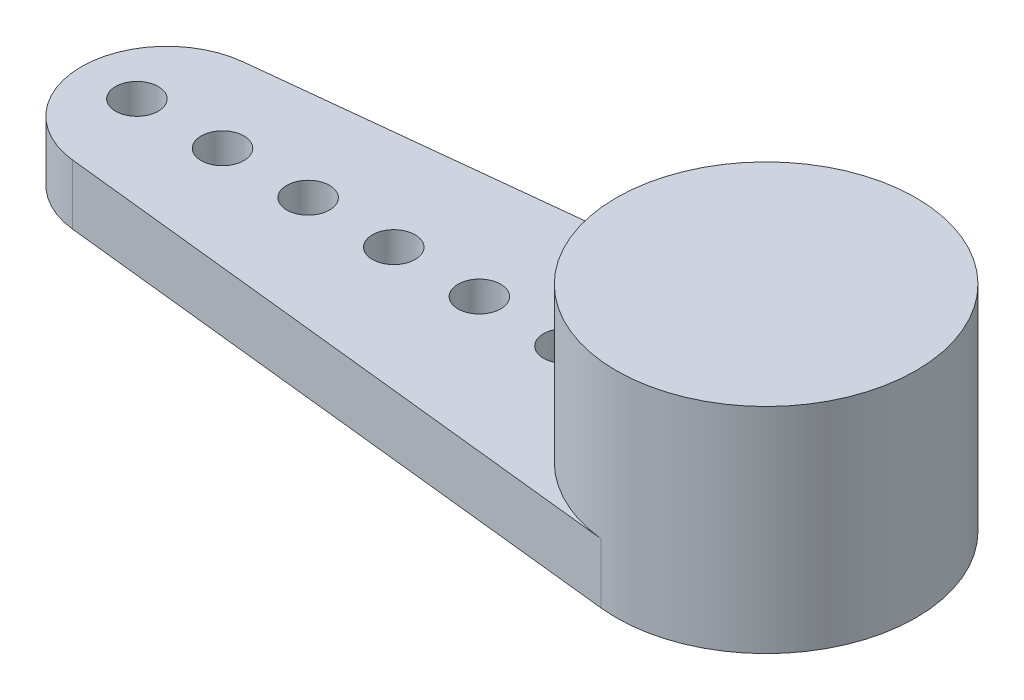
ISO-10303-21;
HEADER;
FILE_DESCRIPTION(('STEP AP214'),'2;1');
FILE_NAME('part.step','',(''),(''),'','','');
FILE_SCHEMA(('AUTOMOTIVE_DESIGN { 1 0 10303 214 1 1 1 1 }'));
ENDSEC;
DATA;
#1=APPLICATION_CONTEXT('core data for automotive mechanical design processes');
#2=APPLICATION_PROTOCOL_DEFINITION('international standard','automotive_design',2000,#1);
#3=PRODUCT_CONTEXT('',#1,'mechanical');
#4=PRODUCT('Part','Part','',(#3));
#5=PRODUCT_RELATED_PRODUCT_CATEGORY('part','',(#4));
#6=PRODUCT_DEFINITION_FORMATION('','',#4);
#7=PRODUCT_DEFINITION_CONTEXT('part definition',#1,'design');
#8=PRODUCT_DEFINITION('design','',#6,#7);
#9=PRODUCT_DEFINITION_SHAPE('','',#8);
#10=(LENGTH_UNIT() NAMED_UNIT(*) SI_UNIT(.MILLI.,.METRE.));
#11=(NAMED_UNIT(*) PLANE_ANGLE_UNIT() SI_UNIT($,.RADIAN.));
#12=(NAMED_UNIT(*) SI_UNIT($,.STERADIAN.) SOLID_ANGLE_UNIT());
#13=UNCERTAINTY_MEASURE_WITH_UNIT(LENGTH_MEASURE(1.E-05),#10,'distance_accuracy_value','');
#14=(GEOMETRIC_REPRESENTATION_CONTEXT(3) GLOBAL_UNCERTAINTY_ASSIGNED_CONTEXT((#13)) GLOBAL_UNIT_ASSIGNED_CONTEXT((#10,
#11,#12)) REPRESENTATION_CONTEXT('',''));
#15=CARTESIAN_POINT('',(0.,0.,0.));
#16=DIRECTION('',(0.,0.,1.));
#17=DIRECTION('',(1.,0.,0.));
#18=AXIS2_PLACEMENT_3D('',#15,#16,#17);
#19=CARTESIAN_POINT('',(-4.7,5.,0.));
#20=DIRECTION('',(0.,-1.,0.));
#21=DIRECTION('',(0.,0.,-1.));
#22=AXIS2_PLACEMENT_3D('',#19,#20,#21);
#23=CYLINDRICAL_SURFACE('',#22,0.500000000000001);
#24=CARTESIAN_POINT('',(-4.7,1.4,0.));
#25=DIRECTION('',(0.,1.,0.));
#26=DIRECTION('',(0.,0.,1.));
#27=AXIS2_PLACEMENT_3D('',#24,#25,#26);
#28=CIRCLE('',#27,0.500000000000001);
#29=CARTESIAN_POINT('',(-4.7,1.4,0.500000000000001));
#30=VERTEX_POINT('',#29);
#31=EDGE_CURVE('E40',#30,#30,#28,.F.);
#32=ORIENTED_EDGE('',*,*,#31,.F.);
#33=EDGE_LOOP('',(#32));
#34=FACE_BOUND('',#33,.T.);
#35=CARTESIAN_POINT('',(-4.7,0.,0.));
#36=DIRECTION('',(0.,1.,0.));
#37=DIRECTION('',(0.,0.,1.));
#38=AXIS2_PLACEMENT_3D('',#35,#36,#37);
#39=CIRCLE('',#38,0.500000000000001);
#40=CARTESIAN_POINT('',(-4.7,0.,0.500000000000001));
#41=VERTEX_POINT('',#40);
#42=EDGE_CURVE('E11',#41,#41,#39,.T.);
#43=ORIENTED_EDGE('',*,*,#42,.F.);
#44=EDGE_LOOP('',(#43));
#45=FACE_BOUND('',#44,.T.);
#46=ADVANCED_FACE('F33',(#34,#45),#23,.F.);
#47=CARTESIAN_POINT('',(-6.7,5.,0.));
#48=DIRECTION('',(0.,-1.,0.));
#49=DIRECTION('',(0.,0.,-1.));
#50=AXIS2_PLACEMENT_3D('',#47,#48,#49);
#51=CYLINDRICAL_SURFACE('',#50,0.500000000000001);
#52=CARTESIAN_POINT('',(-6.7,1.4,0.));
#53=DIRECTION('',(0.,1.,0.));
#54=DIRECTION('',(0.,0.,1.));
#55=AXIS2_PLACEMENT_3D('',#52,#53,#54);
#56=CIRCLE('',#55,0.500000000000001);
#57=CARTESIAN_POINT('',(-6.7,1.4,0.500000000000001));
#58=VERTEX_POINT('',#57);
#59=EDGE_CURVE('E122',#58,#58,#56,.F.);
#60=ORIENTED_EDGE('',*,*,#59,.F.);
#61=EDGE_LOOP('',(#60));
#62=FACE_BOUND('',#61,.T.);
#63=CARTESIAN_POINT('',(-6.7,0.,0.));
#64=DIRECTION('',(0.,1.,0.));
#65=DIRECTION('',(0.,0.,1.));
#66=AXIS2_PLACEMENT_3D('',#63,#64,#65);
#67=CIRCLE('',#66,0.500000000000001);
#68=CARTESIAN_POINT('',(-6.7,0.,0.500000000000001));
#69=VERTEX_POINT('',#68);
#70=EDGE_CURVE('E125',#69,#69,#67,.T.);
#71=ORIENTED_EDGE('',*,*,#70,.F.);
#72=EDGE_LOOP('',(#71));
#73=FACE_BOUND('',#72,.T.);
#74=ADVANCED_FACE('F133',(#62,#73),#51,.F.);
#75=CARTESIAN_POINT('',(-8.7,5.,0.));
#76=DIRECTION('',(0.,-1.,0.));
#77=DIRECTION('',(0.,0.,-1.));
#78=AXIS2_PLACEMENT_3D('',#75,#76,#77);
#79=CYLINDRICAL_SURFACE('',#78,0.500000000000001);
#80=CARTESIAN_POINT('',(-8.7,1.4,0.));
#81=DIRECTION('',(0.,1.,0.));
#82=DIRECTION('',(0.,0.,1.));
#83=AXIS2_PLACEMENT_3D('',#80,#81,#82);
#84=CIRCLE('',#83,0.500000000000001);
#85=CARTESIAN_POINT('',(-8.7,1.4,0.500000000000001));
#86=VERTEX_POINT('',#85);
#87=EDGE_CURVE('E116',#86,#86,#84,.F.);
#88=ORIENTED_EDGE('',*,*,#87,.F.);
#89=EDGE_LOOP('',(#88));
#90=FACE_BOUND('',#89,.T.);
#91=CARTESIAN_POINT('',(-8.7,0.,0.));
#92=DIRECTION('',(0.,1.,0.));
#93=DIRECTION('',(0.,0.,1.));
#94=AXIS2_PLACEMENT_3D('',#91,#92,#93);
#95=CIRCLE('',#94,0.500000000000001);
#96=CARTESIAN_POINT('',(-8.7,0.,0.500000000000001));
#97=VERTEX_POINT('',#96);
#98=EDGE_CURVE('E119',#97,#97,#95,.T.);
#99=ORIENTED_EDGE('',*,*,#98,.F.);
#100=EDGE_LOOP('',(#99));
#101=FACE_BOUND('',#100,.T.);
#102=ADVANCED_FACE('F158',(#90,#101),#79,.F.);
#103=CARTESIAN_POINT('',(-10.7,5.,0.));
#104=DIRECTION('',(0.,-1.,0.));
#105=DIRECTION('',(0.,0.,-1.));
#106=AXIS2_PLACEMENT_3D('',#103,#104,#105);
#107=CYLINDRICAL_SURFACE('',#106,0.500000000000001);
#108=CARTESIAN_POINT('',(-10.7,1.4,0.));
#109=DIRECTION('',(0.,1.,0.));
#110=DIRECTION('',(0.,0.,1.));
#111=AXIS2_PLACEMENT_3D('',#108,#109,#110);
#112=CIRCLE('',#111,0.500000000000001);
#113=CARTESIAN_POINT('',(-10.7,1.4,0.500000000000001));
#114=VERTEX_POINT('',#113);
#115=EDGE_CURVE('E106',#114,#114,#112,.F.);
#116=ORIENTED_EDGE('',*,*,#115,.F.);
#117=EDGE_LOOP('',(#116));
#118=FACE_BOUND('',#117,.T.);
#119=CARTESIAN_POINT('',(-10.7,0.,0.));
#120=DIRECTION('',(0.,1.,0.));
#121=DIRECTION('',(0.,0.,1.));
#122=AXIS2_PLACEMENT_3D('',#119,#120,#121);
#123=CIRCLE('',#122,0.500000000000001);
#124=CARTESIAN_POINT('',(-10.7,0.,0.500000000000001));
#125=VERTEX_POINT('',#124);
#126=EDGE_CURVE('E113',#125,#125,#123,.T.);
#127=ORIENTED_EDGE('',*,*,#126,.F.);
#128=EDGE_LOOP('',(#127));
#129=FACE_BOUND('',#128,.T.);
#130=ADVANCED_FACE('F154',(#118,#129),#107,.F.);
#131=CARTESIAN_POINT('',(0.,5.,0.));
#132=DIRECTION('',(0.,-1.,0.));
#133=DIRECTION('',(0.,0.,-1.));
#134=AXIS2_PLACEMENT_3D('',#131,#132,#133);
#135=CYLINDRICAL_SURFACE('',#134,3.5);
#136=CARTESIAN_POINT('',(0.,5.,0.));
#137=DIRECTION('',(0.,1.,0.));
#138=DIRECTION('',(0.,0.,1.));
#139=AXIS2_PLACEMENT_3D('',#136,#137,#138);
#140=CIRCLE('',#139,3.5);
#141=CARTESIAN_POINT('',(0.,5.,3.5));
#142=VERTEX_POINT('',#141);
#143=EDGE_CURVE('E98',#142,#142,#140,.T.);
#144=ORIENTED_EDGE('',*,*,#143,.F.);
#145=EDGE_LOOP('',(#144));
#146=FACE_BOUND('',#145,.T.);
#147=DIRECTION('',(0.,-1.,0.));
#148=VECTOR('',#147,1.);
#149=CARTESIAN_POINT('',(-0.374999999999999,1.4,3.47985272676876));
#150=LINE('',#149,#148);
#151=CARTESIAN_POINT('',(-0.374999999999999,1.4,3.47985272676876));
#152=VERTEX_POINT('',#151);
#153=CARTESIAN_POINT('',(-0.374999999999999,0.,3.47985272676876));
#154=VERTEX_POINT('',#153);
#155=EDGE_CURVE('E79',#152,#154,#150,.T.);
#156=ORIENTED_EDGE('',*,*,#155,.T.);
#157=CARTESIAN_POINT('',(0.,0.,0.));
#158=DIRECTION('',(0.,1.,0.));
#159=DIRECTION('',(0.,0.,1.));
#160=AXIS2_PLACEMENT_3D('',#157,#158,#159);
#161=CIRCLE('',#160,3.5);
#162=CARTESIAN_POINT('',(-0.375,0.,-3.47985272676876));
#163=VERTEX_POINT('',#162);
#164=EDGE_CURVE('E96',#154,#163,#161,.T.);
#165=ORIENTED_EDGE('',*,*,#164,.T.);
#166=DIRECTION('',(0.,-1.,0.));
#167=VECTOR('',#166,1.);
#168=CARTESIAN_POINT('',(-0.375,1.4,-3.47985272676876));
#169=LINE('',#168,#167);
#170=CARTESIAN_POINT('',(-0.375,1.4,-3.47985272676876));
#171=VERTEX_POINT('',#170);
#172=EDGE_CURVE('E52',#171,#163,#169,.T.);
#173=ORIENTED_EDGE('',*,*,#172,.F.);
#174=CARTESIAN_POINT('',(0.,1.4,0.));
#175=DIRECTION('',(0.,1.,0.));
#176=DIRECTION('',(0.,0.,1.));
#177=AXIS2_PLACEMENT_3D('',#174,#175,#176);
#178=CIRCLE('',#177,3.5);
#179=EDGE_CURVE('E47',#171,#152,#178,.T.);
#180=ORIENTED_EDGE('',*,*,#179,.T.);
#181=EDGE_LOOP('',(#156,#165,#173,#180));
#182=FACE_BOUND('',#181,.T.);
#183=ADVANCED_FACE('F146',(#146,#182),#135,.T.);
#184=CARTESIAN_POINT('',(0.,5.,0.));
#185=DIRECTION('',(0.,1.,0.));
#186=DIRECTION('',(0.,0.,1.));
#187=AXIS2_PLACEMENT_3D('',#184,#185,#186);
#188=PLANE('',#187);
#189=ORIENTED_EDGE('',*,*,#143,.T.);
#190=EDGE_LOOP('',(#189));
#191=FACE_BOUND('',#190,.T.);
#192=ADVANCED_FACE('F138',(#191),#188,.T.);
#193=CARTESIAN_POINT('',(0.,0.,0.));
#194=DIRECTION('',(0.,1.,0.));
#195=DIRECTION('',(0.,0.,1.));
#196=AXIS2_PLACEMENT_3D('',#193,#194,#195);
#197=PLANE('',#196);
#198=CARTESIAN_POINT('',(-12.7,0.,0.));
#199=DIRECTION('',(0.,1.,0.));
#200=DIRECTION('',(0.,0.,1.));
#201=AXIS2_PLACEMENT_3D('',#198,#199,#200);
#202=CIRCLE('',#201,0.500000000000001);
#203=CARTESIAN_POINT('',(-12.7,0.,0.500000000000001));
#204=VERTEX_POINT('',#203);
#205=EDGE_CURVE('E253',#204,#204,#202,.T.);
#206=ORIENTED_EDGE('',*,*,#205,.T.);
#207=EDGE_LOOP('',(#206));
#208=FACE_BOUND('',#207,.T.);
#209=CARTESIAN_POINT('',(-14.7,0.,0.));
#210=DIRECTION('',(0.,1.,0.));
#211=DIRECTION('',(0.,0.,1.));
#212=AXIS2_PLACEMENT_3D('',#209,#210,#211);
#213=CIRCLE('',#212,0.500000000000001);
#214=CARTESIAN_POINT('',(-14.7,0.,0.500000000000001));
#215=VERTEX_POINT('',#214);
#216=EDGE_CURVE('E110',#215,#215,#213,.T.);
#217=ORIENTED_EDGE('',*,*,#216,.T.);
#218=EDGE_LOOP('',(#217));
#219=FACE_BOUND('',#218,.T.);
#220=ORIENTED_EDGE('',*,*,#164,.F.);
#221=DIRECTION('',(0.994243636219647,0.,0.107142857142857));
#222=VECTOR('',#221,1.);
#223=CARTESIAN_POINT('',(-14.2142857142857,0.,1.9884872724393));
#224=LINE('',#223,#222);
#225=CARTESIAN_POINT('',(-14.2142857142857,0.,1.9884872724393));
#226=VERTEX_POINT('',#225);
#227=EDGE_CURVE('E262',#226,#154,#224,.T.);
#228=ORIENTED_EDGE('',*,*,#227,.F.);
#229=CARTESIAN_POINT('',(-14.,0.,0.));
#230=DIRECTION('',(0.,1.,0.));
#231=DIRECTION('',(0.,0.,1.));
#232=AXIS2_PLACEMENT_3D('',#229,#230,#231);
#233=CIRCLE('',#232,2.);
#234=CARTESIAN_POINT('',(-14.2142857142857,0.,-1.98848727243929));
#235=VERTEX_POINT('',#234);
#236=EDGE_CURVE('E95',#235,#226,#233,.T.);
#237=ORIENTED_EDGE('',*,*,#236,.F.);
#238=DIRECTION('',(-0.994243636219647,0.,0.107142857142857));
#239=VECTOR('',#238,1.);
#240=CARTESIAN_POINT('',(-14.2142857142857,0.,-1.98848727243929));
#241=LINE('',#240,#239);
#242=EDGE_CURVE('E91',#163,#235,#241,.T.);
#243=ORIENTED_EDGE('',*,*,#242,.F.);
#244=EDGE_LOOP('',(#220,#228,#237,#243));
#245=FACE_BOUND('',#244,.T.);
#246=ORIENTED_EDGE('',*,*,#126,.T.);
#247=EDGE_LOOP('',(#246));
#248=FACE_BOUND('',#247,.T.);
#249=ORIENTED_EDGE('',*,*,#98,.T.);
#250=EDGE_LOOP('',(#249));
#251=FACE_BOUND('',#250,.T.);
#252=ORIENTED_EDGE('',*,*,#70,.T.);
#253=EDGE_LOOP('',(#252));
#254=FACE_BOUND('',#253,.T.);
#255=ORIENTED_EDGE('',*,*,#42,.T.);
#256=EDGE_LOOP('',(#255));
#257=FACE_BOUND('',#256,.T.);
#258=ADVANCED_FACE('F136',(#208,#219,#245,#248,#251,#254,#257),#197,.F.);
#259=CARTESIAN_POINT('',(-14.,1.4,0.));
#260=DIRECTION('',(0.,-1.,0.));
#261=DIRECTION('',(0.,0.,-1.));
#262=AXIS2_PLACEMENT_3D('',#259,#260,#261);
#263=CYLINDRICAL_SURFACE('',#262,2.);
#264=ORIENTED_EDGE('',*,*,#236,.T.);
#265=DIRECTION('',(0.,-1.,0.));
#266=VECTOR('',#265,1.);
#267=CARTESIAN_POINT('',(-14.2142857142857,1.4,1.9884872724393));
#268=LINE('',#267,#266);
#269=CARTESIAN_POINT('',(-14.2142857142857,1.4,1.9884872724393));
#270=VERTEX_POINT('',#269);
#271=EDGE_CURVE('E77',#270,#226,#268,.T.);
#272=ORIENTED_EDGE('',*,*,#271,.F.);
#273=CARTESIAN_POINT('',(-14.,1.4,0.));
#274=DIRECTION('',(0.,1.,0.));
#275=DIRECTION('',(0.,0.,1.));
#276=AXIS2_PLACEMENT_3D('',#273,#274,#275);
#277=CIRCLE('',#276,2.);
#278=CARTESIAN_POINT('',(-14.2142857142857,1.4,-1.98848727243929));
#279=VERTEX_POINT('',#278);
#280=EDGE_CURVE('E82',#279,#270,#277,.T.);
#281=ORIENTED_EDGE('',*,*,#280,.F.);
#282=DIRECTION('',(0.,-1.,0.));
#283=VECTOR('',#282,1.);
#284=CARTESIAN_POINT('',(-14.2142857142857,1.4,-1.98848727243929));
#285=LINE('',#284,#283);
#286=EDGE_CURVE('E260',#279,#235,#285,.T.);
#287=ORIENTED_EDGE('',*,*,#286,.T.);
#288=EDGE_LOOP('',(#264,#272,#281,#287));
#289=FACE_BOUND('',#288,.T.);
#290=ADVANCED_FACE('F93',(#289),#263,.T.);
#291=CARTESIAN_POINT('',(-14.2142857142857,1.4,1.9884872724393));
#292=DIRECTION('',(0.107142857142857,0.,-0.994243636219647));
#293=DIRECTION('',(-0.994243636219647,0.,-0.107142857142857));
#294=AXIS2_PLACEMENT_3D('',#291,#292,#293);
#295=PLANE('',#294);
#296=ORIENTED_EDGE('',*,*,#227,.T.);
#297=ORIENTED_EDGE('',*,*,#155,.F.);
#298=DIRECTION('',(0.994243636219647,0.,0.107142857142857));
#299=VECTOR('',#298,1.);
#300=CARTESIAN_POINT('',(-14.2142857142857,1.4,1.9884872724393));
#301=LINE('',#300,#299);
#302=EDGE_CURVE('E72',#270,#152,#301,.T.);
#303=ORIENTED_EDGE('',*,*,#302,.F.);
#304=ORIENTED_EDGE('',*,*,#271,.T.);
#305=EDGE_LOOP('',(#296,#297,#303,#304));
#306=FACE_BOUND('',#305,.T.);
#307=ADVANCED_FACE('F75',(#306),#295,.F.);
#308=CARTESIAN_POINT('',(-14.2142857142857,1.4,-1.98848727243929));
#309=DIRECTION('',(0.107142857142857,0.,0.994243636219647));
#310=DIRECTION('',(0.994243636219647,0.,-0.107142857142857));
#311=AXIS2_PLACEMENT_3D('',#308,#309,#310);
#312=PLANE('',#311);
#313=ORIENTED_EDGE('',*,*,#242,.T.);
#314=ORIENTED_EDGE('',*,*,#286,.F.);
#315=DIRECTION('',(-0.994243636219647,0.,0.107142857142857));
#316=VECTOR('',#315,1.);
#317=CARTESIAN_POINT('',(-14.2142857142857,1.4,-1.98848727243929));
#318=LINE('',#317,#316);
#319=EDGE_CURVE('E81',#171,#279,#318,.T.);
#320=ORIENTED_EDGE('',*,*,#319,.F.);
#321=ORIENTED_EDGE('',*,*,#172,.T.);
#322=EDGE_LOOP('',(#313,#314,#320,#321));
#323=FACE_BOUND('',#322,.T.);
#324=ADVANCED_FACE('F173',(#323),#312,.F.);
#325=CARTESIAN_POINT('',(-14.,1.4,0.));
#326=DIRECTION('',(0.,1.,0.));
#327=DIRECTION('',(0.,0.,1.));
#328=AXIS2_PLACEMENT_3D('',#325,#326,#327);
#329=PLANE('',#328);
#330=CARTESIAN_POINT('',(-12.7,1.4,0.));
#331=DIRECTION('',(0.,1.,0.));
#332=DIRECTION('',(0.,0.,1.));
#333=AXIS2_PLACEMENT_3D('',#330,#331,#332);
#334=CIRCLE('',#333,0.500000000000001);
#335=CARTESIAN_POINT('',(-12.7,1.4,0.500000000000001));
#336=VERTEX_POINT('',#335);
#337=EDGE_CURVE('E251',#336,#336,#334,.F.);
#338=ORIENTED_EDGE('',*,*,#337,.T.);
#339=EDGE_LOOP('',(#338));
#340=FACE_BOUND('',#339,.T.);
#341=CARTESIAN_POINT('',(-14.7,1.4,0.));
#342=DIRECTION('',(0.,1.,0.));
#343=DIRECTION('',(0.,0.,1.));
#344=AXIS2_PLACEMENT_3D('',#341,#342,#343);
#345=CIRCLE('',#344,0.500000000000001);
#346=CARTESIAN_POINT('',(-14.7,1.4,0.500000000000001));
#347=VERTEX_POINT('',#346);
#348=EDGE_CURVE('E107',#347,#347,#345,.F.);
#349=ORIENTED_EDGE('',*,*,#348,.T.);
#350=EDGE_LOOP('',(#349));
#351=FACE_BOUND('',#350,.T.);
#352=ORIENTED_EDGE('',*,*,#179,.F.);
#353=ORIENTED_EDGE('',*,*,#319,.T.);
#354=ORIENTED_EDGE('',*,*,#280,.T.);
#355=ORIENTED_EDGE('',*,*,#302,.T.);
#356=EDGE_LOOP('',(#352,#353,#354,#355));
#357=FACE_BOUND('',#356,.T.);
#358=ORIENTED_EDGE('',*,*,#115,.T.);
#359=EDGE_LOOP('',(#358));
#360=FACE_BOUND('',#359,.T.);
#361=ORIENTED_EDGE('',*,*,#87,.T.);
#362=EDGE_LOOP('',(#361));
#363=FACE_BOUND('',#362,.T.);
#364=ORIENTED_EDGE('',*,*,#59,.T.);
#365=EDGE_LOOP('',(#364));
#366=FACE_BOUND('',#365,.T.);
#367=ORIENTED_EDGE('',*,*,#31,.T.);
#368=EDGE_LOOP('',(#367));
#369=FACE_BOUND('',#368,.T.);
#370=ADVANCED_FACE('F85',(#340,#351,#357,#360,#363,#366,#369),#329,.T.);
#371=CARTESIAN_POINT('',(-14.7,5.,0.));
#372=DIRECTION('',(0.,-1.,0.));
#373=DIRECTION('',(0.,0.,-1.));
#374=AXIS2_PLACEMENT_3D('',#371,#372,#373);
#375=CYLINDRICAL_SURFACE('',#374,0.500000000000001);
#376=ORIENTED_EDGE('',*,*,#348,.F.);
#377=EDGE_LOOP('',(#376));
#378=FACE_BOUND('',#377,.T.);
#379=ORIENTED_EDGE('',*,*,#216,.F.);
#380=EDGE_LOOP('',(#379));
#381=FACE_BOUND('',#380,.T.);
#382=ADVANCED_FACE('F172',(#378,#381),#375,.F.);
#383=CARTESIAN_POINT('',(-12.7,5.,0.));
#384=DIRECTION('',(0.,-1.,0.));
#385=DIRECTION('',(0.,0.,-1.));
#386=AXIS2_PLACEMENT_3D('',#383,#384,#385);
#387=CYLINDRICAL_SURFACE('',#386,0.500000000000001);
#388=ORIENTED_EDGE('',*,*,#337,.F.);
#389=EDGE_LOOP('',(#388));
#390=FACE_BOUND('',#389,.T.);
#391=ORIENTED_EDGE('',*,*,#205,.F.);
#392=EDGE_LOOP('',(#391));
#393=FACE_BOUND('',#392,.T.);
#394=ADVANCED_FACE('F180',(#390,#393),#387,.F.);
#395=CLOSED_SHELL('',(#46,#74,#102,#130,#183,#192,#258,#290,#307,#324,#370,#382,#394));
#396=MANIFOLD_SOLID_BREP('B2',#395);
#397=ADVANCED_BREP_SHAPE_REPRESENTATION('',(#18,#396),#14);
#398=SHAPE_DEFINITION_REPRESENTATION(#9,#397);
ENDSEC;
END-ISO-10303-21;
